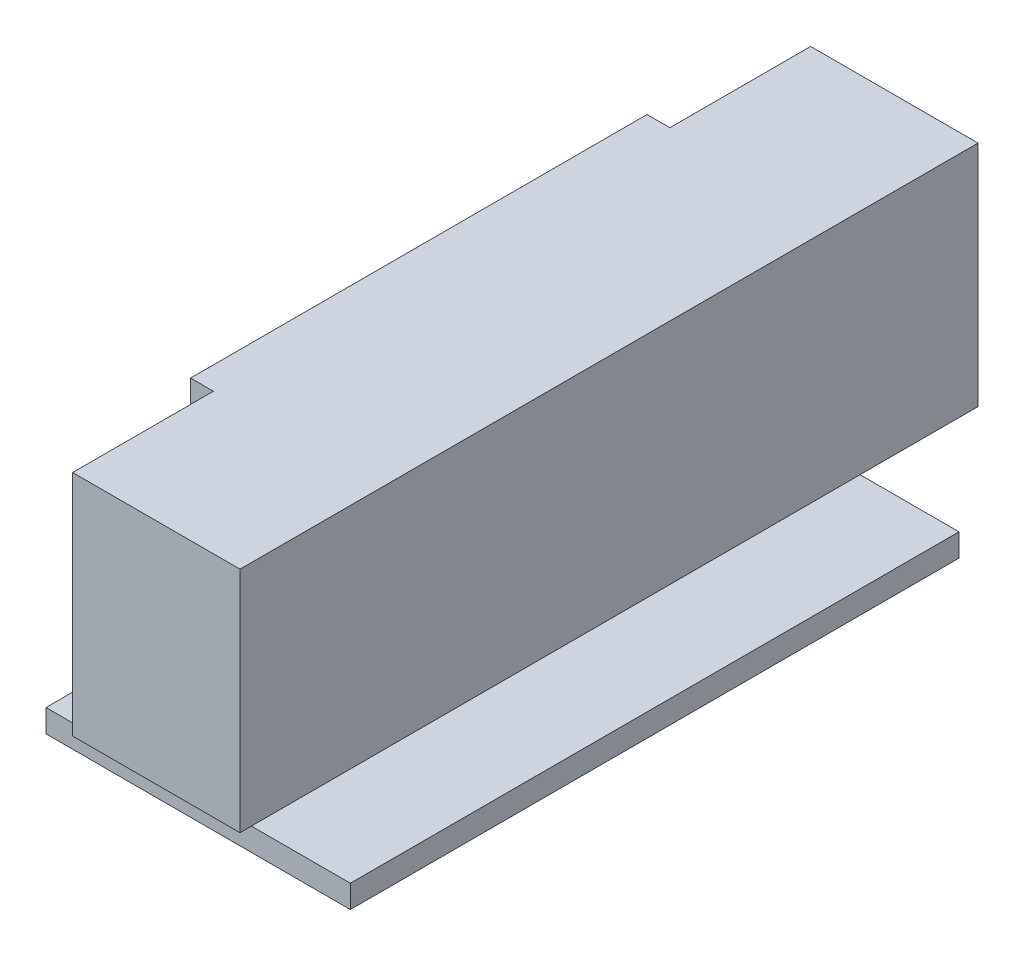
ISO-10303-21;
HEADER;
FILE_DESCRIPTION(('STEP AP214'),'2;1');
FILE_NAME('part.step','',(''),(''),'','','');
FILE_SCHEMA(('AUTOMOTIVE_DESIGN { 1 0 10303 214 1 1 1 1 }'));
ENDSEC;
DATA;
#1=APPLICATION_CONTEXT('core data for automotive mechanical design processes');
#2=APPLICATION_PROTOCOL_DEFINITION('international standard','automotive_design',2000,#1);
#3=PRODUCT_CONTEXT('',#1,'mechanical');
#4=PRODUCT('Part','Part','',(#3));
#5=PRODUCT_RELATED_PRODUCT_CATEGORY('part','',(#4));
#6=PRODUCT_DEFINITION_FORMATION('','',#4);
#7=PRODUCT_DEFINITION_CONTEXT('part definition',#1,'design');
#8=PRODUCT_DEFINITION('design','',#6,#7);
#9=PRODUCT_DEFINITION_SHAPE('','',#8);
#10=(LENGTH_UNIT() NAMED_UNIT(*) SI_UNIT(.MILLI.,.METRE.));
#11=(NAMED_UNIT(*) PLANE_ANGLE_UNIT() SI_UNIT($,.RADIAN.));
#12=(NAMED_UNIT(*) SI_UNIT($,.STERADIAN.) SOLID_ANGLE_UNIT());
#13=UNCERTAINTY_MEASURE_WITH_UNIT(LENGTH_MEASURE(1.E-05),#10,'distance_accuracy_value','');
#14=(GEOMETRIC_REPRESENTATION_CONTEXT(3) GLOBAL_UNCERTAINTY_ASSIGNED_CONTEXT((#13)) GLOBAL_UNIT_ASSIGNED_CONTEXT((#10,
#11,#12)) REPRESENTATION_CONTEXT('',''));
#15=CARTESIAN_POINT('',(0.,0.,0.));
#16=DIRECTION('',(0.,0.,1.));
#17=DIRECTION('',(1.,0.,0.));
#18=AXIS2_PLACEMENT_3D('',#15,#16,#17);
#19=CARTESIAN_POINT('',(0.,3.,0.));
#20=DIRECTION('',(0.,1.,0.));
#21=DIRECTION('',(0.,0.,1.));
#22=AXIS2_PLACEMENT_3D('',#19,#20,#21);
#23=PLANE('',#22);
#24=DIRECTION('',(0.,0.,1.));
#25=VECTOR('',#24,1.);
#26=CARTESIAN_POINT('',(-20.,3.,-40.));
#27=LINE('',#26,#25);
#28=CARTESIAN_POINT('',(-20.,3.,-40.));
#29=VERTEX_POINT('',#28);
#30=CARTESIAN_POINT('',(-20.,3.,40.));
#31=VERTEX_POINT('',#30);
#32=EDGE_CURVE('E191',#29,#31,#27,.T.);
#33=ORIENTED_EDGE('',*,*,#32,.T.);
#34=DIRECTION('',(1.,0.,0.));
#35=VECTOR('',#34,1.);
#36=CARTESIAN_POINT('',(-20.,3.,40.));
#37=LINE('',#36,#35);
#38=CARTESIAN_POINT('',(20.,3.,40.));
#39=VERTEX_POINT('',#38);
#40=EDGE_CURVE('E196',#31,#39,#37,.T.);
#41=ORIENTED_EDGE('',*,*,#40,.T.);
#42=DIRECTION('',(0.,0.,-1.));
#43=VECTOR('',#42,1.);
#44=CARTESIAN_POINT('',(20.,3.,40.));
#45=LINE('',#44,#43);
#46=CARTESIAN_POINT('',(20.,3.,-40.));
#47=VERTEX_POINT('',#46);
#48=EDGE_CURVE('E203',#39,#47,#45,.T.);
#49=ORIENTED_EDGE('',*,*,#48,.T.);
#50=DIRECTION('',(-1.,0.,0.));
#51=VECTOR('',#50,1.);
#52=CARTESIAN_POINT('',(20.,3.,-40.));
#53=LINE('',#52,#51);
#54=EDGE_CURVE('E201',#47,#29,#53,.T.);
#55=ORIENTED_EDGE('',*,*,#54,.T.);
#56=EDGE_LOOP('',(#33,#41,#49,#55));
#57=FACE_BOUND('',#56,.T.);
#58=DIRECTION('',(-1.,0.,0.));
#59=VECTOR('',#58,1.);
#60=CARTESIAN_POINT('',(0.,3.,30.));
#61=LINE('',#60,#59);
#62=CARTESIAN_POINT('',(-8.,3.,30.));
#63=VERTEX_POINT('',#62);
#64=CARTESIAN_POINT('',(-11.,3.,30.));
#65=VERTEX_POINT('',#64);
#66=EDGE_CURVE('E189',#63,#65,#61,.T.);
#67=ORIENTED_EDGE('',*,*,#66,.T.);
#68=DIRECTION('',(0.,0.,-1.));
#69=VECTOR('',#68,1.);
#70=CARTESIAN_POINT('',(-11.,3.,0.));
#71=LINE('',#70,#69);
#72=CARTESIAN_POINT('',(-11.,3.,-30.));
#73=VERTEX_POINT('',#72);
#74=EDGE_CURVE('E192',#65,#73,#71,.T.);
#75=ORIENTED_EDGE('',*,*,#74,.T.);
#76=DIRECTION('',(1.,0.,0.));
#77=VECTOR('',#76,1.);
#78=CARTESIAN_POINT('',(0.,3.,-30.));
#79=LINE('',#78,#77);
#80=CARTESIAN_POINT('',(-8.,3.,-30.));
#81=VERTEX_POINT('',#80);
#82=EDGE_CURVE('E185',#73,#81,#79,.T.);
#83=ORIENTED_EDGE('',*,*,#82,.T.);
#84=DIRECTION('',(0.,0.,1.));
#85=VECTOR('',#84,1.);
#86=CARTESIAN_POINT('',(-8.,3.,0.));
#87=LINE('',#86,#85);
#88=EDGE_CURVE('E183',#81,#63,#87,.T.);
#89=ORIENTED_EDGE('',*,*,#88,.T.);
#90=EDGE_LOOP('',(#67,#75,#83,#89));
#91=FACE_BOUND('',#90,.T.);
#92=ADVANCED_FACE('F43',(#57,#91),#23,.T.);
#93=CARTESIAN_POINT('',(-20.,3.,-40.));
#94=DIRECTION('',(1.,0.,0.));
#95=DIRECTION('',(0.,0.,-1.));
#96=AXIS2_PLACEMENT_3D('',#93,#94,#95);
#97=PLANE('',#96);
#98=DIRECTION('',(0.,0.,1.));
#99=VECTOR('',#98,1.);
#100=CARTESIAN_POINT('',(-20.,0.,-40.));
#101=LINE('',#100,#99);
#102=CARTESIAN_POINT('',(-20.,0.,-40.));
#103=VERTEX_POINT('',#102);
#104=CARTESIAN_POINT('',(-20.,0.,40.));
#105=VERTEX_POINT('',#104);
#106=EDGE_CURVE('E194',#103,#105,#101,.T.);
#107=ORIENTED_EDGE('',*,*,#106,.T.);
#108=DIRECTION('',(0.,-1.,0.));
#109=VECTOR('',#108,1.);
#110=CARTESIAN_POINT('',(-20.,3.,40.));
#111=LINE('',#110,#109);
#112=EDGE_CURVE('E11',#31,#105,#111,.T.);
#113=ORIENTED_EDGE('',*,*,#112,.F.);
#114=ORIENTED_EDGE('',*,*,#32,.F.);
#115=DIRECTION('',(0.,-1.,0.));
#116=VECTOR('',#115,1.);
#117=CARTESIAN_POINT('',(-20.,3.,-40.));
#118=LINE('',#117,#116);
#119=EDGE_CURVE('E202',#29,#103,#118,.T.);
#120=ORIENTED_EDGE('',*,*,#119,.T.);
#121=EDGE_LOOP('',(#107,#113,#114,#120));
#122=FACE_BOUND('',#121,.T.);
#123=ADVANCED_FACE('F44',(#122),#97,.F.);
#124=CARTESIAN_POINT('',(-20.,3.,40.));
#125=DIRECTION('',(0.,0.,-1.));
#126=DIRECTION('',(-1.,0.,0.));
#127=AXIS2_PLACEMENT_3D('',#124,#125,#126);
#128=PLANE('',#127);
#129=DIRECTION('',(1.,0.,0.));
#130=VECTOR('',#129,1.);
#131=CARTESIAN_POINT('',(-20.,0.,40.));
#132=LINE('',#131,#130);
#133=CARTESIAN_POINT('',(20.,0.,40.));
#134=VERTEX_POINT('',#133);
#135=EDGE_CURVE('E208',#105,#134,#132,.T.);
#136=ORIENTED_EDGE('',*,*,#135,.T.);
#137=DIRECTION('',(0.,-1.,0.));
#138=VECTOR('',#137,1.);
#139=CARTESIAN_POINT('',(20.,3.,40.));
#140=LINE('',#139,#138);
#141=EDGE_CURVE('E51',#39,#134,#140,.T.);
#142=ORIENTED_EDGE('',*,*,#141,.F.);
#143=ORIENTED_EDGE('',*,*,#40,.F.);
#144=ORIENTED_EDGE('',*,*,#112,.T.);
#145=EDGE_LOOP('',(#136,#142,#143,#144));
#146=FACE_BOUND('',#145,.T.);
#147=ADVANCED_FACE('F236',(#146),#128,.F.);
#148=CARTESIAN_POINT('',(20.,3.,40.));
#149=DIRECTION('',(-1.,0.,0.));
#150=DIRECTION('',(0.,0.,1.));
#151=AXIS2_PLACEMENT_3D('',#148,#149,#150);
#152=PLANE('',#151);
#153=DIRECTION('',(0.,0.,-1.));
#154=VECTOR('',#153,1.);
#155=CARTESIAN_POINT('',(20.,0.,40.));
#156=LINE('',#155,#154);
#157=CARTESIAN_POINT('',(20.,0.,-40.));
#158=VERTEX_POINT('',#157);
#159=EDGE_CURVE('E209',#134,#158,#156,.T.);
#160=ORIENTED_EDGE('',*,*,#159,.T.);
#161=DIRECTION('',(0.,-1.,0.));
#162=VECTOR('',#161,1.);
#163=CARTESIAN_POINT('',(20.,3.,-40.));
#164=LINE('',#163,#162);
#165=EDGE_CURVE('E214',#47,#158,#164,.T.);
#166=ORIENTED_EDGE('',*,*,#165,.F.);
#167=ORIENTED_EDGE('',*,*,#48,.F.);
#168=ORIENTED_EDGE('',*,*,#141,.T.);
#169=EDGE_LOOP('',(#160,#166,#167,#168));
#170=FACE_BOUND('',#169,.T.);
#171=ADVANCED_FACE('F225',(#170),#152,.F.);
#172=CARTESIAN_POINT('',(20.,3.,-40.));
#173=DIRECTION('',(0.,0.,1.));
#174=DIRECTION('',(1.,0.,0.));
#175=AXIS2_PLACEMENT_3D('',#172,#173,#174);
#176=PLANE('',#175);
#177=DIRECTION('',(-1.,0.,0.));
#178=VECTOR('',#177,1.);
#179=CARTESIAN_POINT('',(20.,0.,-40.));
#180=LINE('',#179,#178);
#181=EDGE_CURVE('E200',#158,#103,#180,.T.);
#182=ORIENTED_EDGE('',*,*,#181,.T.);
#183=ORIENTED_EDGE('',*,*,#119,.F.);
#184=ORIENTED_EDGE('',*,*,#54,.F.);
#185=ORIENTED_EDGE('',*,*,#165,.T.);
#186=EDGE_LOOP('',(#182,#183,#184,#185));
#187=FACE_BOUND('',#186,.T.);
#188=ADVANCED_FACE('F232',(#187),#176,.F.);
#189=CARTESIAN_POINT('',(0.,0.,0.));
#190=DIRECTION('',(0.,1.,0.));
#191=DIRECTION('',(0.,0.,1.));
#192=AXIS2_PLACEMENT_3D('',#189,#190,#191);
#193=PLANE('',#192);
#194=ORIENTED_EDGE('',*,*,#106,.F.);
#195=ORIENTED_EDGE('',*,*,#181,.F.);
#196=ORIENTED_EDGE('',*,*,#159,.F.);
#197=ORIENTED_EDGE('',*,*,#135,.F.);
#198=EDGE_LOOP('',(#194,#195,#196,#197));
#199=FACE_BOUND('',#198,.T.);
#200=ADVANCED_FACE('F229',(#199),#193,.F.);
#201=CARTESIAN_POINT('',(-11.,40.,-30.));
#202=DIRECTION('',(1.,0.,0.));
#203=DIRECTION('',(0.,0.,-1.));
#204=AXIS2_PLACEMENT_3D('',#201,#202,#203);
#205=PLANE('',#204);
#206=ORIENTED_EDGE('',*,*,#74,.F.);
#207=DIRECTION('',(0.,-1.,0.));
#208=VECTOR('',#207,1.);
#209=CARTESIAN_POINT('',(-11.,40.,30.));
#210=LINE('',#209,#208);
#211=CARTESIAN_POINT('',(-11.,40.,30.));
#212=VERTEX_POINT('',#211);
#213=EDGE_CURVE('E179',#212,#65,#210,.T.);
#214=ORIENTED_EDGE('',*,*,#213,.F.);
#215=DIRECTION('',(0.,0.,1.));
#216=VECTOR('',#215,1.);
#217=CARTESIAN_POINT('',(-11.,40.,-30.));
#218=LINE('',#217,#216);
#219=CARTESIAN_POINT('',(-11.,40.,-30.));
#220=VERTEX_POINT('',#219);
#221=EDGE_CURVE('E161',#220,#212,#218,.T.);
#222=ORIENTED_EDGE('',*,*,#221,.F.);
#223=DIRECTION('',(0.,-1.,0.));
#224=VECTOR('',#223,1.);
#225=CARTESIAN_POINT('',(-11.,40.,-30.));
#226=LINE('',#225,#224);
#227=EDGE_CURVE('E172',#220,#73,#226,.T.);
#228=ORIENTED_EDGE('',*,*,#227,.T.);
#229=EDGE_LOOP('',(#206,#214,#222,#228));
#230=FACE_BOUND('',#229,.T.);
#231=ADVANCED_FACE('F253',(#230),#205,.F.);
#232=CARTESIAN_POINT('',(-11.,40.,30.));
#233=DIRECTION('',(0.,0.,-1.));
#234=DIRECTION('',(-1.,0.,0.));
#235=AXIS2_PLACEMENT_3D('',#232,#233,#234);
#236=PLANE('',#235);
#237=ORIENTED_EDGE('',*,*,#66,.F.);
#238=DIRECTION('',(0.,-1.,0.));
#239=VECTOR('',#238,1.);
#240=CARTESIAN_POINT('',(-8.,40.,30.));
#241=LINE('',#240,#239);
#242=CARTESIAN_POINT('',(-8.,10.,30.));
#243=VERTEX_POINT('',#242);
#244=EDGE_CURVE('E177',#243,#63,#241,.T.);
#245=ORIENTED_EDGE('',*,*,#244,.F.);
#246=CARTESIAN_POINT('',(-8.,40.,30.));
#247=VERTEX_POINT('',#246);
#248=EDGE_CURVE('E180',#247,#243,#241,.T.);
#249=ORIENTED_EDGE('',*,*,#248,.F.);
#250=DIRECTION('',(1.,0.,0.));
#251=VECTOR('',#250,1.);
#252=CARTESIAN_POINT('',(-11.,40.,30.));
#253=LINE('',#252,#251);
#254=EDGE_CURVE('E145',#212,#247,#253,.T.);
#255=ORIENTED_EDGE('',*,*,#254,.F.);
#256=ORIENTED_EDGE('',*,*,#213,.T.);
#257=EDGE_LOOP('',(#237,#245,#249,#255,#256));
#258=FACE_BOUND('',#257,.T.);
#259=ADVANCED_FACE('F269',(#258),#236,.F.);
#260=CARTESIAN_POINT('',(-8.,40.,30.));
#261=DIRECTION('',(-1.,0.,0.));
#262=DIRECTION('',(0.,0.,1.));
#263=AXIS2_PLACEMENT_3D('',#260,#261,#262);
#264=PLANE('',#263);
#265=DIRECTION('',(0.,-1.,0.));
#266=VECTOR('',#265,1.);
#267=CARTESIAN_POINT('',(-8.,40.,-30.));
#268=LINE('',#267,#266);
#269=CARTESIAN_POINT('',(-8.,10.,-30.));
#270=VERTEX_POINT('',#269);
#271=EDGE_CURVE('E67',#270,#81,#268,.T.);
#272=ORIENTED_EDGE('',*,*,#271,.F.);
#273=DIRECTION('',(0.,0.,1.));
#274=VECTOR('',#273,1.);
#275=CARTESIAN_POINT('',(-8.,10.,-48.5));
#276=LINE('',#275,#274);
#277=EDGE_CURVE('E464',#270,#243,#276,.T.);
#278=ORIENTED_EDGE('',*,*,#277,.T.);
#279=ORIENTED_EDGE('',*,*,#244,.T.);
#280=ORIENTED_EDGE('',*,*,#88,.F.);
#281=EDGE_LOOP('',(#272,#278,#279,#280));
#282=FACE_BOUND('',#281,.T.);
#283=ADVANCED_FACE('F280',(#282),#264,.F.);
#284=CARTESIAN_POINT('',(-8.,40.,-30.));
#285=DIRECTION('',(0.,0.,1.));
#286=DIRECTION('',(1.,0.,0.));
#287=AXIS2_PLACEMENT_3D('',#284,#285,#286);
#288=PLANE('',#287);
#289=ORIENTED_EDGE('',*,*,#82,.F.);
#290=ORIENTED_EDGE('',*,*,#227,.F.);
#291=DIRECTION('',(-1.,0.,0.));
#292=VECTOR('',#291,1.);
#293=CARTESIAN_POINT('',(-8.,40.,-30.));
#294=LINE('',#293,#292);
#295=CARTESIAN_POINT('',(-8.,40.,-30.));
#296=VERTEX_POINT('',#295);
#297=EDGE_CURVE('E166',#296,#220,#294,.T.);
#298=ORIENTED_EDGE('',*,*,#297,.F.);
#299=EDGE_CURVE('E171',#296,#270,#268,.T.);
#300=ORIENTED_EDGE('',*,*,#299,.T.);
#301=ORIENTED_EDGE('',*,*,#271,.T.);
#302=EDGE_LOOP('',(#289,#290,#298,#300,#301));
#303=FACE_BOUND('',#302,.T.);
#304=ADVANCED_FACE('F281',(#303),#288,.F.);
#305=CARTESIAN_POINT('',(0.,40.,0.));
#306=DIRECTION('',(0.,1.,0.));
#307=DIRECTION('',(0.,0.,1.));
#308=AXIS2_PLACEMENT_3D('',#305,#306,#307);
#309=PLANE('',#308);
#310=ORIENTED_EDGE('',*,*,#221,.T.);
#311=ORIENTED_EDGE('',*,*,#254,.T.);
#312=DIRECTION('',(0.,0.,1.));
#313=VECTOR('',#312,1.);
#314=CARTESIAN_POINT('',(-8.,40.,-48.5));
#315=LINE('',#314,#313);
#316=CARTESIAN_POINT('',(-8.,40.,48.5));
#317=VERTEX_POINT('',#316);
#318=EDGE_CURVE('E138',#247,#317,#315,.T.);
#319=ORIENTED_EDGE('',*,*,#318,.T.);
#320=DIRECTION('',(1.,0.,0.));
#321=VECTOR('',#320,1.);
#322=CARTESIAN_POINT('',(-8.,40.,48.5));
#323=LINE('',#322,#321);
#324=CARTESIAN_POINT('',(14.,40.,48.5));
#325=VERTEX_POINT('',#324);
#326=EDGE_CURVE('E142',#317,#325,#323,.T.);
#327=ORIENTED_EDGE('',*,*,#326,.T.);
#328=DIRECTION('',(0.,0.,-1.));
#329=VECTOR('',#328,1.);
#330=CARTESIAN_POINT('',(14.,40.,48.5));
#331=LINE('',#330,#329);
#332=CARTESIAN_POINT('',(14.,40.,-48.5));
#333=VERTEX_POINT('',#332);
#334=EDGE_CURVE('E158',#325,#333,#331,.T.);
#335=ORIENTED_EDGE('',*,*,#334,.T.);
#336=DIRECTION('',(-1.,0.,0.));
#337=VECTOR('',#336,1.);
#338=CARTESIAN_POINT('',(14.,40.,-48.5));
#339=LINE('',#338,#337);
#340=CARTESIAN_POINT('',(-8.,40.,-48.5));
#341=VERTEX_POINT('',#340);
#342=EDGE_CURVE('E466',#333,#341,#339,.T.);
#343=ORIENTED_EDGE('',*,*,#342,.T.);
#344=EDGE_CURVE('E146',#341,#296,#315,.T.);
#345=ORIENTED_EDGE('',*,*,#344,.T.);
#346=ORIENTED_EDGE('',*,*,#297,.T.);
#347=EDGE_LOOP('',(#310,#311,#319,#327,#335,#343,#345,#346));
#348=FACE_BOUND('',#347,.T.);
#349=ADVANCED_FACE('F143',(#348),#309,.T.);
#350=CARTESIAN_POINT('',(-8.,40.,-48.5));
#351=DIRECTION('',(1.,0.,0.));
#352=DIRECTION('',(0.,0.,-1.));
#353=AXIS2_PLACEMENT_3D('',#350,#351,#352);
#354=PLANE('',#353);
#355=ORIENTED_EDGE('',*,*,#318,.F.);
#356=ORIENTED_EDGE('',*,*,#248,.T.);
#357=CARTESIAN_POINT('',(-8.,10.,48.5));
#358=VERTEX_POINT('',#357);
#359=EDGE_CURVE('E59',#243,#358,#276,.T.);
#360=ORIENTED_EDGE('',*,*,#359,.T.);
#361=DIRECTION('',(0.,-1.,0.));
#362=VECTOR('',#361,1.);
#363=CARTESIAN_POINT('',(-8.,40.,48.5));
#364=LINE('',#363,#362);
#365=EDGE_CURVE('E152',#317,#358,#364,.T.);
#366=ORIENTED_EDGE('',*,*,#365,.F.);
#367=EDGE_LOOP('',(#355,#356,#360,#366));
#368=FACE_BOUND('',#367,.T.);
#369=ADVANCED_FACE('F159',(#368),#354,.F.);
#370=ORIENTED_EDGE('',*,*,#299,.F.);
#371=ORIENTED_EDGE('',*,*,#344,.F.);
#372=DIRECTION('',(0.,-1.,0.));
#373=VECTOR('',#372,1.);
#374=CARTESIAN_POINT('',(-8.,40.,-48.5));
#375=LINE('',#374,#373);
#376=CARTESIAN_POINT('',(-8.,10.,-48.5));
#377=VERTEX_POINT('',#376);
#378=EDGE_CURVE('E474',#341,#377,#375,.T.);
#379=ORIENTED_EDGE('',*,*,#378,.T.);
#380=EDGE_CURVE('E458',#377,#270,#276,.T.);
#381=ORIENTED_EDGE('',*,*,#380,.T.);
#382=EDGE_LOOP('',(#370,#371,#379,#381));
#383=FACE_BOUND('',#382,.T.);
#384=ADVANCED_FACE('F304',(#383),#354,.F.);
#385=CARTESIAN_POINT('',(-8.,40.,48.5));
#386=DIRECTION('',(0.,0.,-1.));
#387=DIRECTION('',(-1.,0.,0.));
#388=AXIS2_PLACEMENT_3D('',#385,#386,#387);
#389=PLANE('',#388);
#390=DIRECTION('',(1.,0.,0.));
#391=VECTOR('',#390,1.);
#392=CARTESIAN_POINT('',(-8.,10.,48.5));
#393=LINE('',#392,#391);
#394=CARTESIAN_POINT('',(14.,10.,48.5));
#395=VERTEX_POINT('',#394);
#396=EDGE_CURVE('E463',#358,#395,#393,.T.);
#397=ORIENTED_EDGE('',*,*,#396,.T.);
#398=DIRECTION('',(0.,-1.,0.));
#399=VECTOR('',#398,1.);
#400=CARTESIAN_POINT('',(14.,40.,48.5));
#401=LINE('',#400,#399);
#402=EDGE_CURVE('E156',#325,#395,#401,.T.);
#403=ORIENTED_EDGE('',*,*,#402,.F.);
#404=ORIENTED_EDGE('',*,*,#326,.F.);
#405=ORIENTED_EDGE('',*,*,#365,.T.);
#406=EDGE_LOOP('',(#397,#403,#404,#405));
#407=FACE_BOUND('',#406,.T.);
#408=ADVANCED_FACE('F153',(#407),#389,.F.);
#409=CARTESIAN_POINT('',(14.,40.,48.5));
#410=DIRECTION('',(-1.,0.,0.));
#411=DIRECTION('',(0.,0.,1.));
#412=AXIS2_PLACEMENT_3D('',#409,#410,#411);
#413=PLANE('',#412);
#414=DIRECTION('',(0.,0.,-1.));
#415=VECTOR('',#414,1.);
#416=CARTESIAN_POINT('',(14.,10.,48.5));
#417=LINE('',#416,#415);
#418=CARTESIAN_POINT('',(14.,10.,-48.5));
#419=VERTEX_POINT('',#418);
#420=EDGE_CURVE('E470',#395,#419,#417,.T.);
#421=ORIENTED_EDGE('',*,*,#420,.T.);
#422=DIRECTION('',(0.,-1.,0.));
#423=VECTOR('',#422,1.);
#424=CARTESIAN_POINT('',(14.,40.,-48.5));
#425=LINE('',#424,#423);
#426=EDGE_CURVE('E163',#333,#419,#425,.T.);
#427=ORIENTED_EDGE('',*,*,#426,.F.);
#428=ORIENTED_EDGE('',*,*,#334,.F.);
#429=ORIENTED_EDGE('',*,*,#402,.T.);
#430=EDGE_LOOP('',(#421,#427,#428,#429));
#431=FACE_BOUND('',#430,.T.);
#432=ADVANCED_FACE('F320',(#431),#413,.F.);
#433=CARTESIAN_POINT('',(14.,40.,-48.5));
#434=DIRECTION('',(0.,0.,1.));
#435=DIRECTION('',(1.,0.,0.));
#436=AXIS2_PLACEMENT_3D('',#433,#434,#435);
#437=PLANE('',#436);
#438=DIRECTION('',(-1.,0.,0.));
#439=VECTOR('',#438,1.);
#440=CARTESIAN_POINT('',(14.,10.,-48.5));
#441=LINE('',#440,#439);
#442=EDGE_CURVE('E149',#419,#377,#441,.T.);
#443=ORIENTED_EDGE('',*,*,#442,.T.);
#444=ORIENTED_EDGE('',*,*,#378,.F.);
#445=ORIENTED_EDGE('',*,*,#342,.F.);
#446=ORIENTED_EDGE('',*,*,#426,.T.);
#447=EDGE_LOOP('',(#443,#444,#445,#446));
#448=FACE_BOUND('',#447,.T.);
#449=ADVANCED_FACE('F322',(#448),#437,.F.);
#450=CARTESIAN_POINT('',(0.,10.,0.));
#451=DIRECTION('',(0.,1.,0.));
#452=DIRECTION('',(0.,0.,1.));
#453=AXIS2_PLACEMENT_3D('',#450,#451,#452);
#454=PLANE('',#453);
#455=ORIENTED_EDGE('',*,*,#380,.F.);
#456=ORIENTED_EDGE('',*,*,#442,.F.);
#457=ORIENTED_EDGE('',*,*,#420,.F.);
#458=ORIENTED_EDGE('',*,*,#396,.F.);
#459=ORIENTED_EDGE('',*,*,#359,.F.);
#460=ORIENTED_EDGE('',*,*,#277,.F.);
#461=EDGE_LOOP('',(#455,#456,#457,#458,#459,#460));
#462=FACE_BOUND('',#461,.T.);
#463=ADVANCED_FACE('F335',(#462),#454,.F.);
#464=CLOSED_SHELL('',(#92,#123,#147,#171,#188,#200,#231,#259,#283,#304,#349,#369,#384,#408,#432,
#449,#463));
#465=MANIFOLD_SOLID_BREP('B2',#464);
#466=ADVANCED_BREP_SHAPE_REPRESENTATION('',(#18,#465),#14);
#467=SHAPE_DEFINITION_REPRESENTATION(#9,#466);
ENDSEC;
END-ISO-10303-21;
